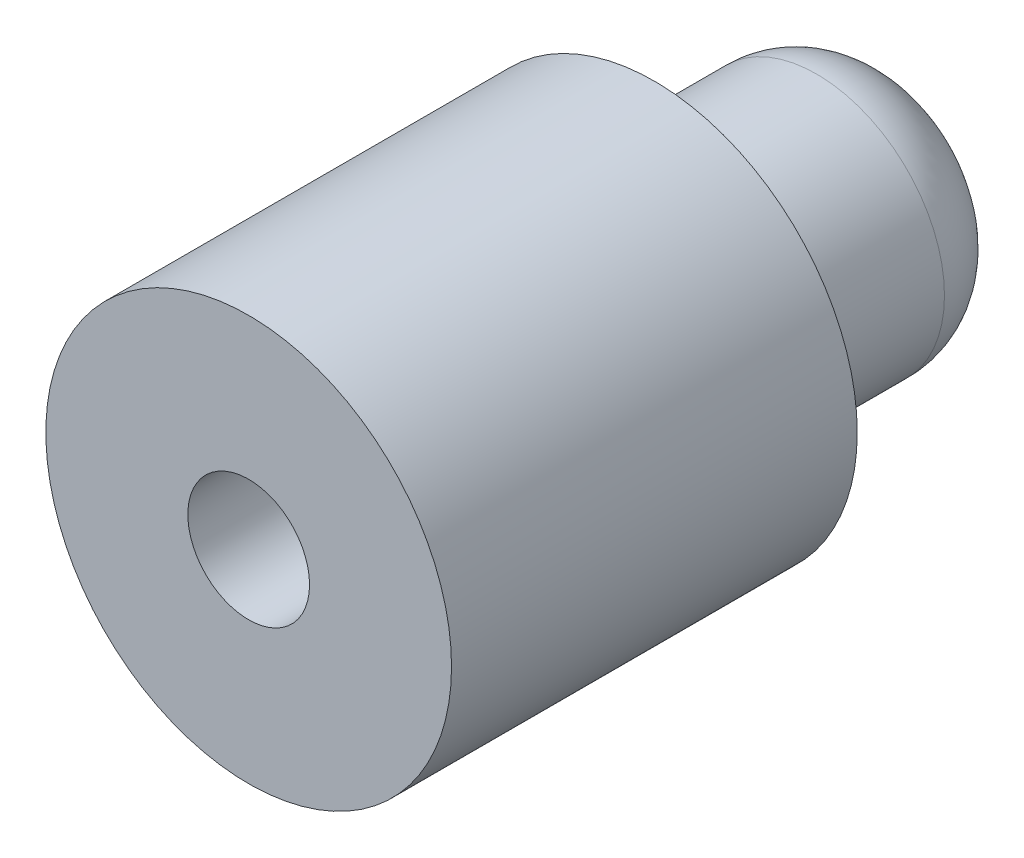
ISO-10303-21;
HEADER;
FILE_DESCRIPTION(('STEP AP214'),'2;1');
FILE_NAME('part.step','',(''),(''),'','','');
FILE_SCHEMA(('AUTOMOTIVE_DESIGN { 1 0 10303 214 1 1 1 1 }'));
ENDSEC;
DATA;
#1=APPLICATION_CONTEXT('core data for automotive mechanical design processes');
#2=APPLICATION_PROTOCOL_DEFINITION('international standard','automotive_design',2000,#1);
#3=PRODUCT_CONTEXT('',#1,'mechanical');
#4=PRODUCT('Part','Part','',(#3));
#5=PRODUCT_RELATED_PRODUCT_CATEGORY('part','',(#4));
#6=PRODUCT_DEFINITION_FORMATION('','',#4);
#7=PRODUCT_DEFINITION_CONTEXT('part definition',#1,'design');
#8=PRODUCT_DEFINITION('design','',#6,#7);
#9=PRODUCT_DEFINITION_SHAPE('','',#8);
#10=(LENGTH_UNIT() NAMED_UNIT(*) SI_UNIT(.MILLI.,.METRE.));
#11=(NAMED_UNIT(*) PLANE_ANGLE_UNIT() SI_UNIT($,.RADIAN.));
#12=(NAMED_UNIT(*) SI_UNIT($,.STERADIAN.) SOLID_ANGLE_UNIT());
#13=UNCERTAINTY_MEASURE_WITH_UNIT(LENGTH_MEASURE(1.E-05),#10,'distance_accuracy_value','');
#14=(GEOMETRIC_REPRESENTATION_CONTEXT(3) GLOBAL_UNCERTAINTY_ASSIGNED_CONTEXT((#13)) GLOBAL_UNIT_ASSIGNED_CONTEXT((#10,
#11,#12)) REPRESENTATION_CONTEXT('',''));
#15=CARTESIAN_POINT('',(0.,0.,0.));
#16=DIRECTION('',(0.,0.,1.));
#17=DIRECTION('',(1.,0.,0.));
#18=AXIS2_PLACEMENT_3D('',#15,#16,#17);
#19=CARTESIAN_POINT('',(0.,0.,6.));
#20=DIRECTION('',(0.,0.,-1.));
#21=DIRECTION('',(-1.,0.,0.));
#22=AXIS2_PLACEMENT_3D('',#19,#20,#21);
#23=CYLINDRICAL_SURFACE('',#22,3.15);
#24=CARTESIAN_POINT('',(0.,0.,2.));
#25=DIRECTION('',(0.,0.,1.));
#26=DIRECTION('',(1.,0.,0.));
#27=AXIS2_PLACEMENT_3D('',#24,#25,#26);
#28=CIRCLE('',#27,3.15);
#29=CARTESIAN_POINT('',(3.15,0.,2.));
#30=VERTEX_POINT('',#29);
#31=EDGE_CURVE('E41',#30,#30,#28,.T.);
#32=ORIENTED_EDGE('',*,*,#31,.T.);
#33=EDGE_LOOP('',(#32));
#34=FACE_BOUND('',#33,.T.);
#35=CARTESIAN_POINT('',(0.,0.,6.));
#36=DIRECTION('',(0.,0.,1.));
#37=DIRECTION('',(1.,0.,0.));
#38=AXIS2_PLACEMENT_3D('',#35,#36,#37);
#39=CIRCLE('',#38,3.15);
#40=CARTESIAN_POINT('',(3.15,0.,6.));
#41=VERTEX_POINT('',#40);
#42=EDGE_CURVE('E45',#41,#41,#39,.T.);
#43=ORIENTED_EDGE('',*,*,#42,.F.);
#44=EDGE_LOOP('',(#43));
#45=FACE_BOUND('',#44,.T.);
#46=ADVANCED_FACE('F34',(#34,#45),#23,.T.);
#47=CARTESIAN_POINT('',(0.,0.,0.));
#48=DIRECTION('',(0.,0.,1.));
#49=DIRECTION('',(1.,0.,0.));
#50=AXIS2_PLACEMENT_3D('',#47,#48,#49);
#51=PLANE('',#50);
#52=CARTESIAN_POINT('',(0.,0.,0.));
#53=DIRECTION('',(0.,0.,1.));
#54=DIRECTION('',(1.,0.,0.));
#55=AXIS2_PLACEMENT_3D('',#52,#53,#54);
#56=CIRCLE('',#55,1.15);
#57=CARTESIAN_POINT('',(1.15,0.,0.));
#58=VERTEX_POINT('',#57);
#59=EDGE_CURVE('E10',#58,#58,#56,.F.);
#60=ORIENTED_EDGE('',*,*,#59,.T.);
#61=EDGE_LOOP('',(#60));
#62=FACE_BOUND('',#61,.T.);
#63=ADVANCED_FACE('F82',(#62),#51,.F.);
#64=CARTESIAN_POINT('',(0.,0.,16.));
#65=DIRECTION('',(0.,0.,-1.));
#66=DIRECTION('',(-1.,0.,0.));
#67=AXIS2_PLACEMENT_3D('',#64,#65,#66);
#68=CYLINDRICAL_SURFACE('',#67,5.);
#69=CARTESIAN_POINT('',(0.,0.,16.));
#70=DIRECTION('',(0.,0.,1.));
#71=DIRECTION('',(1.,0.,0.));
#72=AXIS2_PLACEMENT_3D('',#69,#70,#71);
#73=CIRCLE('',#72,5.);
#74=CARTESIAN_POINT('',(5.,0.,16.));
#75=VERTEX_POINT('',#74);
#76=EDGE_CURVE('E49',#75,#75,#73,.T.);
#77=ORIENTED_EDGE('',*,*,#76,.F.);
#78=EDGE_LOOP('',(#77));
#79=FACE_BOUND('',#78,.T.);
#80=CARTESIAN_POINT('',(0.,0.,6.));
#81=DIRECTION('',(0.,0.,1.));
#82=DIRECTION('',(1.,0.,0.));
#83=AXIS2_PLACEMENT_3D('',#80,#81,#82);
#84=CIRCLE('',#83,5.);
#85=CARTESIAN_POINT('',(5.,0.,6.));
#86=VERTEX_POINT('',#85);
#87=EDGE_CURVE('E52',#86,#86,#84,.T.);
#88=ORIENTED_EDGE('',*,*,#87,.T.);
#89=EDGE_LOOP('',(#88));
#90=FACE_BOUND('',#89,.T.);
#91=ADVANCED_FACE('F76',(#79,#90),#68,.T.);
#92=CARTESIAN_POINT('',(0.,0.,16.));
#93=DIRECTION('',(0.,0.,1.));
#94=DIRECTION('',(1.,0.,0.));
#95=AXIS2_PLACEMENT_3D('',#92,#93,#94);
#96=PLANE('',#95);
#97=CARTESIAN_POINT('',(0.,0.,16.));
#98=DIRECTION('',(0.,0.,1.));
#99=DIRECTION('',(1.,0.,0.));
#100=AXIS2_PLACEMENT_3D('',#97,#98,#99);
#101=CIRCLE('',#100,1.5);
#102=CARTESIAN_POINT('',(1.5,0.,16.));
#103=VERTEX_POINT('',#102);
#104=EDGE_CURVE('E58',#103,#103,#101,.T.);
#105=ORIENTED_EDGE('',*,*,#104,.F.);
#106=EDGE_LOOP('',(#105));
#107=FACE_BOUND('',#106,.T.);
#108=ORIENTED_EDGE('',*,*,#76,.T.);
#109=EDGE_LOOP('',(#108));
#110=FACE_BOUND('',#109,.T.);
#111=ADVANCED_FACE('F73',(#107,#110),#96,.T.);
#112=CARTESIAN_POINT('',(0.,0.,6.));
#113=DIRECTION('',(0.,0.,1.));
#114=DIRECTION('',(1.,0.,0.));
#115=AXIS2_PLACEMENT_3D('',#112,#113,#114);
#116=PLANE('',#115);
#117=ORIENTED_EDGE('',*,*,#42,.T.);
#118=EDGE_LOOP('',(#117));
#119=FACE_BOUND('',#118,.T.);
#120=ORIENTED_EDGE('',*,*,#87,.F.);
#121=EDGE_LOOP('',(#120));
#122=FACE_BOUND('',#121,.T.);
#123=ADVANCED_FACE('F69',(#119,#122),#116,.F.);
#124=CARTESIAN_POINT('',(0.,0.,6.));
#125=DIRECTION('',(0.,0.,1.));
#126=DIRECTION('',(1.,0.,0.));
#127=AXIS2_PLACEMENT_3D('',#124,#125,#126);
#128=CYLINDRICAL_SURFACE('',#127,1.5);
#129=CARTESIAN_POINT('',(0.,0.,6.));
#130=DIRECTION('',(0.,0.,1.));
#131=DIRECTION('',(1.,0.,0.));
#132=AXIS2_PLACEMENT_3D('',#129,#130,#131);
#133=CIRCLE('',#132,1.5);
#134=CARTESIAN_POINT('',(1.5,0.,6.));
#135=VERTEX_POINT('',#134);
#136=EDGE_CURVE('E55',#135,#135,#133,.T.);
#137=ORIENTED_EDGE('',*,*,#136,.F.);
#138=EDGE_LOOP('',(#137));
#139=FACE_BOUND('',#138,.T.);
#140=ORIENTED_EDGE('',*,*,#104,.T.);
#141=EDGE_LOOP('',(#140));
#142=FACE_BOUND('',#141,.T.);
#143=ADVANCED_FACE('F66',(#139,#142),#128,.F.);
#144=CARTESIAN_POINT('',(0.,0.,6.));
#145=DIRECTION('',(0.,0.,1.));
#146=DIRECTION('',(1.,0.,0.));
#147=AXIS2_PLACEMENT_3D('',#144,#145,#146);
#148=PLANE('',#147);
#149=ORIENTED_EDGE('',*,*,#136,.T.);
#150=EDGE_LOOP('',(#149));
#151=FACE_BOUND('',#150,.T.);
#152=ADVANCED_FACE('F64',(#151),#148,.T.);
#153=CARTESIAN_POINT('',(0.,0.,2.));
#154=DIRECTION('',(0.,0.,1.));
#155=DIRECTION('',(1.,0.,0.));
#156=AXIS2_PLACEMENT_3D('',#153,#154,#155);
#157=DEGENERATE_TOROIDAL_SURFACE('',#156,1.15,2.,.T.);
#158=ORIENTED_EDGE('',*,*,#59,.F.);
#159=EDGE_LOOP('',(#158));
#160=FACE_BOUND('',#159,.T.);
#161=ORIENTED_EDGE('',*,*,#31,.F.);
#162=EDGE_LOOP('',(#161));
#163=FACE_BOUND('',#162,.T.);
#164=ADVANCED_FACE('F36',(#160,#163),#157,.T.);
#165=CLOSED_SHELL('',(#46,#63,#91,#111,#123,#143,#152,#164));
#166=MANIFOLD_SOLID_BREP('B2',#165);
#167=ADVANCED_BREP_SHAPE_REPRESENTATION('',(#18,#166),#14);
#168=SHAPE_DEFINITION_REPRESENTATION(#9,#167);
ENDSEC;
END-ISO-10303-21;
